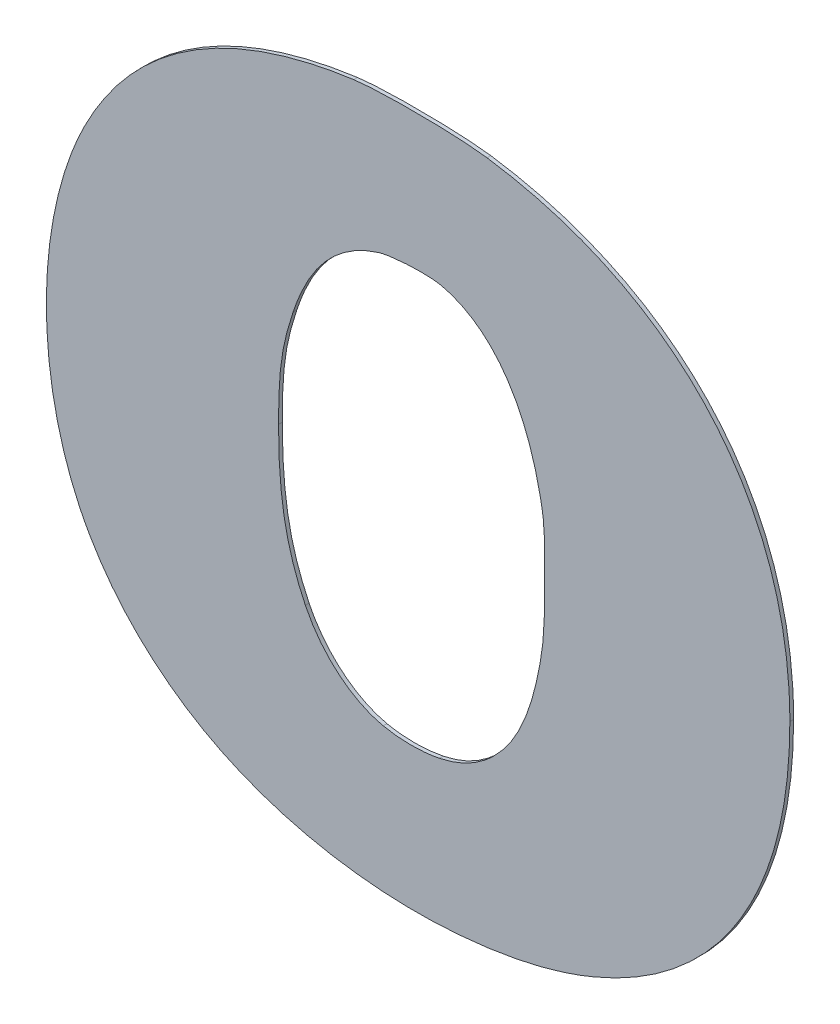
ISO-10303-21;
HEADER;
FILE_DESCRIPTION(('STEP AP214'),'2;1');
FILE_NAME('part.step','',(''),(''),'','','');
FILE_SCHEMA(('AUTOMOTIVE_DESIGN { 1 0 10303 214 1 1 1 1 }'));
ENDSEC;
DATA;
#1=APPLICATION_CONTEXT('core data for automotive mechanical design processes');
#2=APPLICATION_PROTOCOL_DEFINITION('international standard','automotive_design',2000,#1);
#3=PRODUCT_CONTEXT('',#1,'mechanical');
#4=PRODUCT('Part','Part','',(#3));
#5=PRODUCT_RELATED_PRODUCT_CATEGORY('part','',(#4));
#6=PRODUCT_DEFINITION_FORMATION('','',#4);
#7=PRODUCT_DEFINITION_CONTEXT('part definition',#1,'design');
#8=PRODUCT_DEFINITION('design','',#6,#7);
#9=PRODUCT_DEFINITION_SHAPE('','',#8);
#10=(LENGTH_UNIT() NAMED_UNIT(*) SI_UNIT(.MILLI.,.METRE.));
#11=(NAMED_UNIT(*) PLANE_ANGLE_UNIT() SI_UNIT($,.RADIAN.));
#12=(NAMED_UNIT(*) SI_UNIT($,.STERADIAN.) SOLID_ANGLE_UNIT());
#13=UNCERTAINTY_MEASURE_WITH_UNIT(LENGTH_MEASURE(1.E-05),#10,'distance_accuracy_value','');
#14=(GEOMETRIC_REPRESENTATION_CONTEXT(3) GLOBAL_UNCERTAINTY_ASSIGNED_CONTEXT((#13)) GLOBAL_UNIT_ASSIGNED_CONTEXT((#10,
#11,#12)) REPRESENTATION_CONTEXT('',''));
#15=CARTESIAN_POINT('',(0.,0.,0.));
#16=DIRECTION('',(0.,0.,1.));
#17=DIRECTION('',(1.,0.,0.));
#18=AXIS2_PLACEMENT_3D('',#15,#16,#17);
#19=CARTESIAN_POINT('',(-0.260986287756,-0.254246271886,0.002950587767671));
#20=CARTESIAN_POINT('',(-0.260986287756,-0.254246271886,-0.00064941223232888));
#21=CARTESIAN_POINT('',(-0.314815367579,-0.250637417308,0.002950587767671));
#22=CARTESIAN_POINT('',(-0.314815367579,-0.250637417308,-0.00064941223232888));
#23=CARTESIAN_POINT('',(-0.364272880494,-0.236795568774,0.002950587767671));
#24=CARTESIAN_POINT('',(-0.364272880494,-0.236795568774,-0.00064941223232888));
#25=CARTESIAN_POINT('',(-0.404177297623,-0.214170874374,0.002950587767671));
#26=CARTESIAN_POINT('',(-0.404177297623,-0.214170874374,-0.00064941223232888));
#27=B_SPLINE_SURFACE_WITH_KNOTS('',3,1,((#19,#20),(#21,#22),(#23,#24),(#25,#26)),.UNSPECIFIED.,
.F.,.F.,.F.,(4,4),(2,2),(0.,1.),(0.,0.000359999999999988),.UNSPECIFIED.);
#28=DIRECTION('',(0.,0.,1.));
#29=VECTOR('',#28,1.);
#30=CARTESIAN_POINT('',(-0.260986287756,-0.254246271886,-4.94122323289002E-05));
#31=LINE('',#30,#29);
#32=CARTESIAN_POINT('',(-0.260986326892577,-0.254246377310995,-4.94122323289002E-05));
#33=VERTEX_POINT('',#32);
#34=CARTESIAN_POINT('',(-0.260986323137633,-0.254246377562793,0.002950587767671));
#35=VERTEX_POINT('',#34);
#36=EDGE_CURVE('E11',#33,#35,#31,.T.);
#37=CARTESIAN_POINT('',(-0.260986287756,-0.254246271886,0.002950587767671));
#38=CARTESIAN_POINT('',(-0.314815367579,-0.250637417308,0.002950587767671));
#39=CARTESIAN_POINT('',(-0.364272880494,-0.236795568774,0.002950587767671));
#40=CARTESIAN_POINT('',(-0.404177297623,-0.214170874374,0.002950587767671));
#41=B_SPLINE_CURVE_WITH_KNOTS('',3,(#37,#38,#39,#40),.UNSPECIFIED.,.F.,.F.,(4,4),(0.,1.),.UNSPECIFIED.);
#42=CARTESIAN_POINT('',(-0.404177297623,-0.214170874374,0.002950587767671));
#43=VERTEX_POINT('',#42);
#44=EDGE_CURVE('E27',#35,#43,#41,.T.);
#45=DIRECTION('',(0.,0.,1.));
#46=VECTOR('',#45,1.);
#47=CARTESIAN_POINT('',(-0.404177297623,-0.214170874374,-4.94122323289E-05));
#48=LINE('',#47,#46);
#49=CARTESIAN_POINT('',(-0.404177297623,-0.214170874374,-4.94122323289E-05));
#50=VERTEX_POINT('',#49);
#51=EDGE_CURVE('E449',#50,#43,#48,.T.);
#52=CARTESIAN_POINT('',(-0.404177297623,-0.214170874374,-4.94122323289002E-05));
#53=CARTESIAN_POINT('',(-0.364272880494,-0.236795568774,-4.94122323289002E-05));
#54=CARTESIAN_POINT('',(-0.314815367579,-0.250637417308,-4.94122323289002E-05));
#55=CARTESIAN_POINT('',(-0.260986287756,-0.254246271886,-4.94122323289002E-05));
#56=B_SPLINE_CURVE_WITH_KNOTS('',3,(#52,#53,#54,#55),.UNSPECIFIED.,.F.,.F.,(4,4),(0.,1.),.UNSPECIFIED.);
#57=EDGE_CURVE('E469',#33,#50,#56,.F.);
#58=ORIENTED_EDGE('',*,*,#36,.T.);
#59=ORIENTED_EDGE('',*,*,#44,.T.);
#60=ORIENTED_EDGE('',*,*,#51,.F.);
#61=ORIENTED_EDGE('',*,*,#57,.F.);
#62=EDGE_LOOP('',(#58,#59,#60,#61));
#63=FACE_BOUND('',#62,.T.);
#64=ADVANCED_FACE('F17',(#63),#27,.T.);
#65=CARTESIAN_POINT('',(-0.404177297623,-0.214170874374,0.002950587767671));
#66=CARTESIAN_POINT('',(-0.404177297623,-0.214170874374,-0.00064941223232888));
#67=CARTESIAN_POINT('',(-0.448275198308,-0.189168548063,0.002950587767671));
#68=CARTESIAN_POINT('',(-0.448275198308,-0.189168548063,-0.00064941223232888));
#69=CARTESIAN_POINT('',(-0.482670704263,-0.152874736419,0.002950587767671));
#70=CARTESIAN_POINT('',(-0.482670704263,-0.152874736419,-0.00064941223232888));
#71=CARTESIAN_POINT('',(-0.503606742316,-0.10925374049,0.002950587767671));
#72=CARTESIAN_POINT('',(-0.503606742316,-0.10925374049,-0.00064941223232888));
#73=B_SPLINE_SURFACE_WITH_KNOTS('',3,1,((#65,#66),(#67,#68),(#69,#70),(#71,#72)),.UNSPECIFIED.,
.F.,.F.,.F.,(4,4),(2,2),(0.,1.),(0.,0.000359999999999988),.UNSPECIFIED.);
#74=CARTESIAN_POINT('',(-0.404177297623,-0.214170874374,0.002950587767671));
#75=CARTESIAN_POINT('',(-0.448275198308,-0.189168548063,0.002950587767671));
#76=CARTESIAN_POINT('',(-0.482670704263,-0.152874736419,0.002950587767671));
#77=CARTESIAN_POINT('',(-0.503606742316,-0.10925374049,0.002950587767671));
#78=B_SPLINE_CURVE_WITH_KNOTS('',3,(#74,#75,#76,#77),.UNSPECIFIED.,.F.,.F.,(4,4),(0.,1.),.UNSPECIFIED.);
#79=CARTESIAN_POINT('',(-0.503606742316,-0.10925374049,0.002950587767671));
#80=VERTEX_POINT('',#79);
#81=EDGE_CURVE('E445',#43,#80,#78,.T.);
#82=DIRECTION('',(0.,0.,1.));
#83=VECTOR('',#82,1.);
#84=CARTESIAN_POINT('',(-0.503606742316,-0.10925374049,-4.94122323289E-05));
#85=LINE('',#84,#83);
#86=CARTESIAN_POINT('',(-0.503606742316,-0.10925374049,-4.94122323289E-05));
#87=VERTEX_POINT('',#86);
#88=EDGE_CURVE('E480',#87,#80,#85,.T.);
#89=CARTESIAN_POINT('',(-0.503606742316,-0.10925374049,-4.94122323289002E-05));
#90=CARTESIAN_POINT('',(-0.482670704263,-0.152874736419,-4.94122323289002E-05));
#91=CARTESIAN_POINT('',(-0.448275198308,-0.189168548063,-4.94122323289002E-05));
#92=CARTESIAN_POINT('',(-0.404177297623,-0.214170874374,-4.94122323289002E-05));
#93=B_SPLINE_CURVE_WITH_KNOTS('',3,(#89,#90,#91,#92),.UNSPECIFIED.,.F.,.F.,(4,4),(0.,1.),.UNSPECIFIED.);
#94=EDGE_CURVE('E473',#50,#87,#93,.F.);
#95=ORIENTED_EDGE('',*,*,#51,.T.);
#96=ORIENTED_EDGE('',*,*,#81,.T.);
#97=ORIENTED_EDGE('',*,*,#88,.F.);
#98=ORIENTED_EDGE('',*,*,#94,.F.);
#99=EDGE_LOOP('',(#95,#96,#97,#98));
#100=FACE_BOUND('',#99,.T.);
#101=ADVANCED_FACE('F478',(#100),#73,.T.);
#102=CARTESIAN_POINT('',(-0.503606742316,-0.10925374049,0.002950587767671));
#103=CARTESIAN_POINT('',(-0.503606742316,-0.10925374049,-0.00064941223232888));
#104=CARTESIAN_POINT('',(-0.540622635321,-0.03212981605444,0.002950587767671));
#105=CARTESIAN_POINT('',(-0.540622635321,-0.03212981605444,-0.00064941223232888));
#106=CARTESIAN_POINT('',(-0.539096242076,0.07896214475445,0.002950587767671));
#107=CARTESIAN_POINT('',(-0.539096242076,0.07896214475445,-0.00064941223232888));
#108=CARTESIAN_POINT('',(-0.499949731596,0.156907418266,0.002950587767671));
#109=CARTESIAN_POINT('',(-0.499949731596,0.156907418266,-0.00064941223232888));
#110=B_SPLINE_SURFACE_WITH_KNOTS('',3,1,((#102,#103),(#104,#105),(#106,#107),(#108,#109)),
.UNSPECIFIED.,.F.,.F.,.F.,(4,4),(2,2),(0.,1.),(0.,0.000359999999999988),.UNSPECIFIED.);
#111=CARTESIAN_POINT('',(-0.503606742316,-0.10925374049,0.002950587767671));
#112=CARTESIAN_POINT('',(-0.540622635321,-0.03212981605444,0.002950587767671));
#113=CARTESIAN_POINT('',(-0.539096242076,0.07896214475445,0.002950587767671));
#114=CARTESIAN_POINT('',(-0.499949731596,0.156907418266,0.002950587767671));
#115=B_SPLINE_CURVE_WITH_KNOTS('',3,(#111,#112,#113,#114),.UNSPECIFIED.,.F.,.F.,(4,4),(0.,1.),.UNSPECIFIED.);
#116=CARTESIAN_POINT('',(-0.499949731596,0.156907418266,0.002950587767671));
#117=VERTEX_POINT('',#116);
#118=EDGE_CURVE('E481',#80,#117,#115,.T.);
#119=DIRECTION('',(0.,0.,1.));
#120=VECTOR('',#119,1.);
#121=CARTESIAN_POINT('',(-0.499949731596,0.156907418266,-4.94122323289E-05));
#122=LINE('',#121,#120);
#123=CARTESIAN_POINT('',(-0.499949731596,0.156907418266,-4.94122323289E-05));
#124=VERTEX_POINT('',#123);
#125=EDGE_CURVE('E1027',#124,#117,#122,.T.);
#126=CARTESIAN_POINT('',(-0.503606742316,-0.10925374049,-4.94122323289E-05));
#127=CARTESIAN_POINT('',(-0.540622635321,-0.03212981605444,-4.94122323289E-05));
#128=CARTESIAN_POINT('',(-0.539096242076,0.07896214475445,-4.94122323289E-05));
#129=CARTESIAN_POINT('',(-0.499949731596,0.156907418266,-4.94122323289E-05));
#130=B_SPLINE_CURVE_WITH_KNOTS('',3,(#126,#127,#128,#129),.UNSPECIFIED.,.F.,.F.,(4,4),(0.,1.),.UNSPECIFIED.);
#131=EDGE_CURVE('E1028',#87,#124,#130,.T.);
#132=ORIENTED_EDGE('',*,*,#88,.T.);
#133=ORIENTED_EDGE('',*,*,#118,.T.);
#134=ORIENTED_EDGE('',*,*,#125,.F.);
#135=ORIENTED_EDGE('',*,*,#131,.F.);
#136=EDGE_LOOP('',(#132,#133,#134,#135));
#137=FACE_BOUND('',#136,.T.);
#138=ADVANCED_FACE('F288',(#137),#110,.T.);
#139=CARTESIAN_POINT('',(-0.499949731596,0.156907418266,0.002950587767671));
#140=CARTESIAN_POINT('',(-0.499949731596,0.156907418266,-0.00064941223232888));
#141=CARTESIAN_POINT('',(-0.460287858503,0.235878921768,0.002950587767671));
#142=CARTESIAN_POINT('',(-0.460287858503,0.235878921768,-0.00064941223232888));
#143=CARTESIAN_POINT('',(-0.387406244325,0.283300900132,0.002950587767671));
#144=CARTESIAN_POINT('',(-0.387406244325,0.283300900132,-0.00064941223232888));
#145=CARTESIAN_POINT('',(-0.284138936396,0.297329387866,0.002950587767671));
#146=CARTESIAN_POINT('',(-0.284138936396,0.297329387866,-0.00064941223232888));
#147=B_SPLINE_SURFACE_WITH_KNOTS('',3,1,((#139,#140),(#141,#142),(#143,#144),(#145,#146)),
.UNSPECIFIED.,.F.,.F.,.F.,(4,4),(2,2),(0.,1.),(0.,0.000359999999999988),.UNSPECIFIED.);
#148=CARTESIAN_POINT('',(-0.499949731596,0.156907418266,0.002950587767671));
#149=CARTESIAN_POINT('',(-0.460287858503,0.235878921768,0.002950587767671));
#150=CARTESIAN_POINT('',(-0.387406244325,0.283300900132,0.002950587767671));
#151=CARTESIAN_POINT('',(-0.284138936396,0.297329387866,0.002950587767671));
#152=B_SPLINE_CURVE_WITH_KNOTS('',3,(#148,#149,#150,#151),.UNSPECIFIED.,.F.,.F.,(4,4),(0.,1.),.UNSPECIFIED.);
#153=CARTESIAN_POINT('',(-0.284138936396,0.297329387866,0.002950587767671));
#154=VERTEX_POINT('',#153);
#155=EDGE_CURVE('E256',#117,#154,#152,.T.);
#156=DIRECTION('',(0.,0.,1.));
#157=VECTOR('',#156,1.);
#158=CARTESIAN_POINT('',(-0.284138936396,0.297329387866,-4.94122323289E-05));
#159=LINE('',#158,#157);
#160=CARTESIAN_POINT('',(-0.284138936396,0.297329387866,-4.94122323289E-05));
#161=VERTEX_POINT('',#160);
#162=EDGE_CURVE('E253',#161,#154,#159,.T.);
#163=CARTESIAN_POINT('',(-0.284138936396,0.297329387866,-4.94122323289002E-05));
#164=CARTESIAN_POINT('',(-0.387406244325,0.283300900132,-4.94122323289002E-05));
#165=CARTESIAN_POINT('',(-0.460287858503,0.235878921768,-4.94122323289002E-05));
#166=CARTESIAN_POINT('',(-0.499949731596,0.156907418266,-4.94122323289002E-05));
#167=B_SPLINE_CURVE_WITH_KNOTS('',3,(#163,#164,#165,#166),.UNSPECIFIED.,.F.,.F.,(4,4),(0.,1.),.UNSPECIFIED.);
#168=EDGE_CURVE('E249',#124,#161,#167,.F.);
#169=ORIENTED_EDGE('',*,*,#125,.T.);
#170=ORIENTED_EDGE('',*,*,#155,.T.);
#171=ORIENTED_EDGE('',*,*,#162,.F.);
#172=ORIENTED_EDGE('',*,*,#168,.F.);
#173=EDGE_LOOP('',(#169,#170,#171,#172));
#174=FACE_BOUND('',#173,.T.);
#175=ADVANCED_FACE('F275',(#174),#147,.T.);
#176=CARTESIAN_POINT('',(-0.284138936396,0.297329387866,0.002950587767671));
#177=CARTESIAN_POINT('',(-0.284138936396,0.297329387866,-0.00064941223232888));
#178=CARTESIAN_POINT('',(-0.260930606441,0.300482162301,0.002950587767671));
#179=CARTESIAN_POINT('',(-0.260930606441,0.300482162301,-0.00064941223232888));
#180=CARTESIAN_POINT('',(-0.201802736663,0.300025883474,0.002950587767671));
#181=CARTESIAN_POINT('',(-0.201802736663,0.300025883474,-0.00064941223232888));
#182=CARTESIAN_POINT('',(-0.177346047508,0.296505306879,0.002950587767671));
#183=CARTESIAN_POINT('',(-0.177346047508,0.296505306879,-0.00064941223232888));
#184=B_SPLINE_SURFACE_WITH_KNOTS('',3,1,((#176,#177),(#178,#179),(#180,#181),(#182,#183)),
.UNSPECIFIED.,.F.,.F.,.F.,(4,4),(2,2),(0.,1.),(0.,0.000359999999999988),.UNSPECIFIED.);
#185=CARTESIAN_POINT('',(-0.284138936396,0.297329387866,0.002950587767671));
#186=CARTESIAN_POINT('',(-0.260930606441,0.300482162301,0.002950587767671));
#187=CARTESIAN_POINT('',(-0.201802736663,0.300025883474,0.002950587767671));
#188=CARTESIAN_POINT('',(-0.177346047508,0.296505306879,0.002950587767671));
#189=B_SPLINE_CURVE_WITH_KNOTS('',3,(#185,#186,#187,#188),.UNSPECIFIED.,.F.,.F.,(4,4),(0.,1.),.UNSPECIFIED.);
#190=CARTESIAN_POINT('',(-0.177346047508,0.296505306879,0.002950587767671));
#191=VERTEX_POINT('',#190);
#192=EDGE_CURVE('E304',#154,#191,#189,.T.);
#193=DIRECTION('',(0.,0.,1.));
#194=VECTOR('',#193,1.);
#195=CARTESIAN_POINT('',(-0.177346047508,0.296505306879,-4.94122323289E-05));
#196=LINE('',#195,#194);
#197=CARTESIAN_POINT('',(-0.177346047508,0.296505306879,-4.94122323289E-05));
#198=VERTEX_POINT('',#197);
#199=EDGE_CURVE('E311',#198,#191,#196,.T.);
#200=CARTESIAN_POINT('',(-0.284138936396,0.297329387866,-4.94122323289E-05));
#201=CARTESIAN_POINT('',(-0.260930606441,0.300482162301,-4.94122323289E-05));
#202=CARTESIAN_POINT('',(-0.201802736663,0.300025883474,-4.94122323289E-05));
#203=CARTESIAN_POINT('',(-0.177346047508,0.296505306879,-4.94122323289E-05));
#204=B_SPLINE_CURVE_WITH_KNOTS('',3,(#200,#201,#202,#203),.UNSPECIFIED.,.F.,.F.,(4,4),(0.,1.),.UNSPECIFIED.);
#205=EDGE_CURVE('E321',#161,#198,#204,.T.);
#206=ORIENTED_EDGE('',*,*,#162,.T.);
#207=ORIENTED_EDGE('',*,*,#192,.T.);
#208=ORIENTED_EDGE('',*,*,#199,.F.);
#209=ORIENTED_EDGE('',*,*,#205,.F.);
#210=EDGE_LOOP('',(#206,#207,#208,#209));
#211=FACE_BOUND('',#210,.T.);
#212=ADVANCED_FACE('F287',(#211),#184,.T.);
#213=CARTESIAN_POINT('',(-0.177346047508,0.296505306879,0.002950587767671));
#214=CARTESIAN_POINT('',(-0.177346047508,0.296505306879,-0.00064941223232888));
#215=CARTESIAN_POINT('',(-0.02531742937421,0.27462062511,0.002950587767671));
#216=CARTESIAN_POINT('',(-0.02531742937421,0.27462062511,-0.00064941223232888));
#217=CARTESIAN_POINT('',(0.06521462787024,0.173905269857,0.002950587767671));
#218=CARTESIAN_POINT('',(0.06521462787024,0.173905269857,-0.00064941223232888));
#219=CARTESIAN_POINT('',(0.06521462787024,0.02666078687889,0.002950587767671));
#220=CARTESIAN_POINT('',(0.06521462787024,0.02666078687889,-0.00064941223232888));
#221=B_SPLINE_SURFACE_WITH_KNOTS('',3,1,((#213,#214),(#215,#216),(#217,#218),(#219,#220)),
.UNSPECIFIED.,.F.,.F.,.F.,(4,4),(2,2),(0.,1.),(0.,0.000359999999999988),.UNSPECIFIED.);
#222=CARTESIAN_POINT('',(-0.177346047508,0.296505306879,0.002950587767671));
#223=CARTESIAN_POINT('',(-0.02531742937421,0.27462062511,0.002950587767671));
#224=CARTESIAN_POINT('',(0.06521462787024,0.173905269857,0.002950587767671));
#225=CARTESIAN_POINT('',(0.06521462787024,0.0266607868788901,0.002950587767671));
#226=B_SPLINE_CURVE_WITH_KNOTS('',3,(#222,#223,#224,#225),.UNSPECIFIED.,.F.,.F.,(4,4),(0.,
0.040304320984337),.UNSPECIFIED.);
#227=CARTESIAN_POINT('',(0.06521462787024,0.02666078687889,0.002950587767671));
#228=VERTEX_POINT('',#227);
#229=EDGE_CURVE('E323',#191,#228,#226,.T.);
#230=DIRECTION('',(0.,0.,1.));
#231=VECTOR('',#230,1.);
#232=CARTESIAN_POINT('',(0.06521462787024,0.02666078687889,-4.94122323289E-05));
#233=LINE('',#232,#231);
#234=CARTESIAN_POINT('',(0.06521462787024,0.02666078687889,-4.94122323289E-05));
#235=VERTEX_POINT('',#234);
#236=EDGE_CURVE('E332',#235,#228,#233,.T.);
#237=CARTESIAN_POINT('',(-0.177346047508,0.296505306879,-4.94122323289002E-05));
#238=CARTESIAN_POINT('',(-0.02531742937421,0.27462062511,-4.94122323289002E-05));
#239=CARTESIAN_POINT('',(0.06521462787024,0.173905269857,-4.94122323289002E-05));
#240=CARTESIAN_POINT('',(0.06521462787024,0.0266607868788901,-4.94122323289002E-05));
#241=B_SPLINE_CURVE_WITH_KNOTS('',3,(#237,#238,#239,#240),.UNSPECIFIED.,.F.,.F.,(4,4),(0.,
0.040304320984337),.UNSPECIFIED.);
#242=EDGE_CURVE('E342',#198,#235,#241,.T.);
#243=ORIENTED_EDGE('',*,*,#199,.T.);
#244=ORIENTED_EDGE('',*,*,#229,.T.);
#245=ORIENTED_EDGE('',*,*,#236,.F.);
#246=ORIENTED_EDGE('',*,*,#242,.F.);
#247=EDGE_LOOP('',(#243,#244,#245,#246));
#248=FACE_BOUND('',#247,.T.);
#249=ADVANCED_FACE('F376',(#248),#221,.T.);
#250=CARTESIAN_POINT('',(0.06521462787024,0.02666078687889,0.002950587767671));
#251=CARTESIAN_POINT('',(0.06521462787024,0.02666078687889,-0.00064941223232888));
#252=CARTESIAN_POINT('',(0.06521462787024,-0.105759290899,0.002950587767671));
#253=CARTESIAN_POINT('',(0.06521462787024,-0.105759290899,-0.00064941223232888));
#254=CARTESIAN_POINT('',(0.000904943603572406,-0.199930874632,0.002950587767671));
#255=CARTESIAN_POINT('',(0.000904943603572406,-0.199930874632,-0.00064941223232888));
#256=CARTESIAN_POINT('',(-0.115303352752,-0.237679677299,0.002950587767671));
#257=CARTESIAN_POINT('',(-0.115303352752,-0.237679677299,-0.00064941223232888));
#258=B_SPLINE_SURFACE_WITH_KNOTS('',3,1,((#250,#251),(#252,#253),(#254,#255),(#256,#257)),
.UNSPECIFIED.,.F.,.F.,.F.,(4,4),(2,2),(0.,1.),(0.,0.000359999999999988),.UNSPECIFIED.);
#259=CARTESIAN_POINT('',(0.06521462787024,0.02666078687889,0.002950587767671));
#260=CARTESIAN_POINT('',(0.06521462787024,-0.105759290899,0.002950587767671));
#261=CARTESIAN_POINT('',(0.000904943603572406,-0.199930874632,0.002950587767671));
#262=CARTESIAN_POINT('',(-0.115303352752,-0.237679677299,0.002950587767671));
#263=B_SPLINE_CURVE_WITH_KNOTS('',3,(#259,#260,#261,#262),.UNSPECIFIED.,.F.,.F.,(4,4),(0.,1.),.UNSPECIFIED.);
#264=CARTESIAN_POINT('',(-0.115303352752,-0.237679677299,0.002950587767671));
#265=VERTEX_POINT('',#264);
#266=EDGE_CURVE('E347',#228,#265,#263,.T.);
#267=DIRECTION('',(0.,0.,1.));
#268=VECTOR('',#267,1.);
#269=CARTESIAN_POINT('',(-0.115303352752,-0.237679677299,-4.94122323289E-05));
#270=LINE('',#269,#268);
#271=CARTESIAN_POINT('',(-0.115303352752,-0.237679677299,-4.94122323289E-05));
#272=VERTEX_POINT('',#271);
#273=EDGE_CURVE('E402',#272,#265,#270,.T.);
#274=CARTESIAN_POINT('',(-0.115303352752,-0.237679677299,-4.94122323289002E-05));
#275=CARTESIAN_POINT('',(0.000904943603572406,-0.199930874632,-4.94122323289002E-05));
#276=CARTESIAN_POINT('',(0.06521462787024,-0.105759290899,-4.94122323289002E-05));
#277=CARTESIAN_POINT('',(0.06521462787024,0.02666078687889,-4.94122323289002E-05));
#278=B_SPLINE_CURVE_WITH_KNOTS('',3,(#274,#275,#276,#277),.UNSPECIFIED.,.F.,.F.,(4,4),(0.,1.),.UNSPECIFIED.);
#279=EDGE_CURVE('E401',#235,#272,#278,.F.);
#280=ORIENTED_EDGE('',*,*,#236,.T.);
#281=ORIENTED_EDGE('',*,*,#266,.T.);
#282=ORIENTED_EDGE('',*,*,#273,.F.);
#283=ORIENTED_EDGE('',*,*,#279,.F.);
#284=EDGE_LOOP('',(#280,#281,#282,#283));
#285=FACE_BOUND('',#284,.T.);
#286=ADVANCED_FACE('F364',(#285),#258,.T.);
#287=CARTESIAN_POINT('',(-0.115303352752,-0.237679677299,0.002950587767671));
#288=CARTESIAN_POINT('',(-0.115303352752,-0.237679677299,-0.00064941223232888));
#289=CARTESIAN_POINT('',(-0.157555214174,-0.251404674543,0.002950587767671));
#290=CARTESIAN_POINT('',(-0.157555214174,-0.251404674543,-0.00064941223232888));
#291=CARTESIAN_POINT('',(-0.211637989196,-0.257554827343,0.002950587767671));
#292=CARTESIAN_POINT('',(-0.211637989196,-0.257554827343,-0.00064941223232888));
#293=CARTESIAN_POINT('',(-0.260986362263,-0.254246482988,0.002950587767671));
#294=CARTESIAN_POINT('',(-0.260986362263,-0.254246482988,-0.00064941223232888));
#295=B_SPLINE_SURFACE_WITH_KNOTS('',3,1,((#287,#288),(#289,#290),(#291,#292),(#293,#294)),
.UNSPECIFIED.,.F.,.F.,.F.,(4,4),(2,2),(0.,1.),(0.,0.000359999999999988),.UNSPECIFIED.);
#296=CARTESIAN_POINT('',(-0.115303352752,-0.237679677299,0.002950587767671));
#297=CARTESIAN_POINT('',(-0.157555214174,-0.251404674543,0.002950587767671));
#298=CARTESIAN_POINT('',(-0.211637989196,-0.257554827343,0.002950587767671));
#299=CARTESIAN_POINT('',(-0.260986362263,-0.254246482988,0.002950587767671));
#300=B_SPLINE_CURVE_WITH_KNOTS('',3,(#296,#297,#298,#299),.UNSPECIFIED.,.F.,.F.,(4,4),(0.,1.),.UNSPECIFIED.);
#301=EDGE_CURVE('E404',#265,#35,#300,.T.);
#302=CARTESIAN_POINT('',(-0.260986362263,-0.254246482988,-4.94122323289002E-05));
#303=CARTESIAN_POINT('',(-0.211637989196,-0.257554827343,-4.94122323289002E-05));
#304=CARTESIAN_POINT('',(-0.157555214174,-0.251404674543,-4.94122323289002E-05));
#305=CARTESIAN_POINT('',(-0.115303352752,-0.237679677299,-4.94122323289002E-05));
#306=B_SPLINE_CURVE_WITH_KNOTS('',3,(#302,#303,#304,#305),.UNSPECIFIED.,.F.,.F.,(4,4),(0.,1.),.UNSPECIFIED.);
#307=EDGE_CURVE('E406',#272,#33,#306,.F.);
#308=ORIENTED_EDGE('',*,*,#273,.T.);
#309=ORIENTED_EDGE('',*,*,#301,.T.);
#310=ORIENTED_EDGE('',*,*,#36,.F.);
#311=ORIENTED_EDGE('',*,*,#307,.F.);
#312=EDGE_LOOP('',(#308,#309,#310,#311));
#313=FACE_BOUND('',#312,.T.);
#314=ADVANCED_FACE('F375',(#313),#295,.T.);
#315=CARTESIAN_POINT('',(-0.215427075401,-0.139132031423,0.002950587767671));
#316=CARTESIAN_POINT('',(-0.215427075401,-0.139132031423,-0.00064941223232888));
#317=CARTESIAN_POINT('',(-0.198030513801,-0.135463347992,0.002950587767671));
#318=CARTESIAN_POINT('',(-0.198030513801,-0.135463347992,-0.00064941223232888));
#319=CARTESIAN_POINT('',(-0.184004633801,-0.127858949237,0.002950587767671));
#320=CARTESIAN_POINT('',(-0.184004633801,-0.127858949237,-0.00064941223232888));
#321=CARTESIAN_POINT('',(-0.171421823756,-0.115273680472,0.002950587767671));
#322=CARTESIAN_POINT('',(-0.171421823756,-0.115273680472,-0.00064941223232888));
#323=B_SPLINE_SURFACE_WITH_KNOTS('',3,1,((#315,#316),(#317,#318),(#319,#320),(#321,#322)),
.UNSPECIFIED.,.F.,.F.,.F.,(4,4),(2,2),(0.,1.),(0.,0.000359999999999988),.UNSPECIFIED.);
#324=DIRECTION('',(0.,0.,1.));
#325=VECTOR('',#324,1.);
#326=CARTESIAN_POINT('',(-0.215427075401,-0.139132031423,-4.94122323289002E-05));
#327=LINE('',#326,#325);
#328=CARTESIAN_POINT('',(-0.215427071496612,-0.139131875378257,-4.94122323289002E-05));
#329=VERTEX_POINT('',#328);
#330=CARTESIAN_POINT('',(-0.215427079333868,-0.139131877031377,0.002950587767671));
#331=VERTEX_POINT('',#330);
#332=EDGE_CURVE('E177',#329,#331,#327,.T.);
#333=CARTESIAN_POINT('',(-0.215427047992814,-0.139132025643006,0.002950587767671));
#334=CARTESIAN_POINT('',(-0.198030499069201,-0.135463340004872,0.002950587767671));
#335=CARTESIAN_POINT('',(-0.18400462719295,-0.127858942627659,0.002950587767671));
#336=CARTESIAN_POINT('',(-0.171421823756,-0.115273680472,0.002950587767671));
#337=B_SPLINE_CURVE_WITH_KNOTS('',3,(#333,#334,#335,#336),.UNSPECIFIED.,.F.,.F.,(4,4),
(5.25164872490667E-07,1.),.UNSPECIFIED.);
#338=CARTESIAN_POINT('',(-0.171421823756,-0.115273680472,0.002950587767671));
#339=VERTEX_POINT('',#338);
#340=EDGE_CURVE('E409',#331,#339,#337,.T.);
#341=DIRECTION('',(0.,0.,1.));
#342=VECTOR('',#341,1.);
#343=CARTESIAN_POINT('',(-0.171421823756,-0.115273680472,-4.94122323289E-05));
#344=LINE('',#343,#342);
#345=CARTESIAN_POINT('',(-0.171421823756,-0.115273680472,-4.94122323289E-05));
#346=VERTEX_POINT('',#345);
#347=EDGE_CURVE('E413',#346,#339,#344,.T.);
#348=CARTESIAN_POINT('',(-0.215427040155477,-0.139132023990222,-4.94122323289E-05));
#349=CARTESIAN_POINT('',(-0.198030494856662,-0.135463337720963,-4.94122323289E-05));
#350=CARTESIAN_POINT('',(-0.184004625303386,-0.127858940737726,-4.94122323289E-05));
#351=CARTESIAN_POINT('',(-0.171421823756,-0.115273680472,-4.94122323289E-05));
#352=B_SPLINE_CURVE_WITH_KNOTS('',3,(#348,#349,#350,#351),.UNSPECIFIED.,.F.,.F.,(4,4),
(6.75335122205991E-07,1.),.UNSPECIFIED.);
#353=EDGE_CURVE('E752',#329,#346,#352,.T.);
#354=ORIENTED_EDGE('',*,*,#332,.T.);
#355=ORIENTED_EDGE('',*,*,#340,.T.);
#356=ORIENTED_EDGE('',*,*,#347,.F.);
#357=ORIENTED_EDGE('',*,*,#353,.F.);
#358=EDGE_LOOP('',(#354,#355,#356,#357));
#359=FACE_BOUND('',#358,.T.);
#360=ADVANCED_FACE('F584',(#359),#323,.T.);
#361=CARTESIAN_POINT('',(-0.171421823756,-0.115273680472,0.002950587767671));
#362=CARTESIAN_POINT('',(-0.171421823756,-0.115273680472,-0.00064941223232888));
#363=CARTESIAN_POINT('',(-0.153024016734,-0.09687213569888,0.002950587767671));
#364=CARTESIAN_POINT('',(-0.153024016734,-0.09687213569888,-0.00064941223232888));
#365=CARTESIAN_POINT('',(-0.141936058779,-0.07188648646333,0.002950587767671));
#366=CARTESIAN_POINT('',(-0.141936058779,-0.07188648646333,-0.00064941223232888));
#367=CARTESIAN_POINT('',(-0.134887231401,-0.03294624769,0.002950587767671));
#368=CARTESIAN_POINT('',(-0.134887231401,-0.03294624769,-0.00064941223232888));
#369=B_SPLINE_SURFACE_WITH_KNOTS('',3,1,((#361,#362),(#363,#364),(#365,#366),(#367,#368)),
.UNSPECIFIED.,.F.,.F.,.F.,(4,4),(2,2),(0.,1.),(0.,0.000359999999999988),.UNSPECIFIED.);
#370=CARTESIAN_POINT('',(-0.171421823756,-0.115273680472,0.002950587767671));
#371=CARTESIAN_POINT('',(-0.153024016734,-0.09687213569888,0.002950587767671));
#372=CARTESIAN_POINT('',(-0.141936058779,-0.07188648646333,0.002950587767671));
#373=CARTESIAN_POINT('',(-0.134887231401,-0.03294624769,0.002950587767671));
#374=B_SPLINE_CURVE_WITH_KNOTS('',3,(#370,#371,#372,#373),.UNSPECIFIED.,.F.,.F.,(4,4),(0.,1.),.UNSPECIFIED.);
#375=CARTESIAN_POINT('',(-0.134887231401,-0.03294624769,0.002950587767671));
#376=VERTEX_POINT('',#375);
#377=EDGE_CURVE('E746',#339,#376,#374,.T.);
#378=DIRECTION('',(0.,0.,1.));
#379=VECTOR('',#378,1.);
#380=CARTESIAN_POINT('',(-0.134887231401,-0.03294624769,-4.94122323289E-05));
#381=LINE('',#380,#379);
#382=CARTESIAN_POINT('',(-0.134887231401,-0.03294624769,-4.94122323289E-05));
#383=VERTEX_POINT('',#382);
#384=EDGE_CURVE('E773',#383,#376,#381,.T.);
#385=CARTESIAN_POINT('',(-0.171421823756,-0.115273680472,-4.94122323289E-05));
#386=CARTESIAN_POINT('',(-0.153024016734,-0.09687213569888,-4.94122323289E-05));
#387=CARTESIAN_POINT('',(-0.141936058779,-0.07188648646333,-4.94122323289E-05));
#388=CARTESIAN_POINT('',(-0.134887231401,-0.03294624769,-4.94122323289E-05));
#389=B_SPLINE_CURVE_WITH_KNOTS('',3,(#385,#386,#387,#388),.UNSPECIFIED.,.F.,.F.,(4,4),(0.,1.),.UNSPECIFIED.);
#390=EDGE_CURVE('E751',#346,#383,#389,.T.);
#391=ORIENTED_EDGE('',*,*,#347,.T.);
#392=ORIENTED_EDGE('',*,*,#377,.T.);
#393=ORIENTED_EDGE('',*,*,#384,.F.);
#394=ORIENTED_EDGE('',*,*,#390,.F.);
#395=EDGE_LOOP('',(#391,#392,#393,#394));
#396=FACE_BOUND('',#395,.T.);
#397=ADVANCED_FACE('F592',(#396),#369,.T.);
#398=CARTESIAN_POINT('',(-0.134887231401,-0.03294624769,0.002950587767671));
#399=CARTESIAN_POINT('',(-0.134887231401,-0.03294624769,-0.00064941223232888));
#400=CARTESIAN_POINT('',(-0.131958871045,-0.01676917395666,0.002950587767671));
#401=CARTESIAN_POINT('',(-0.131958871045,-0.01676917395666,-0.00064941223232888));
#402=CARTESIAN_POINT('',(-0.131304454156,-0.006473147361106,0.002950587767671));
#403=CARTESIAN_POINT('',(-0.131304454156,-0.006473147361106,-0.00064941223232888));
#404=CARTESIAN_POINT('',(-0.131165995934,0.02559239853223,0.002950587767671));
#405=CARTESIAN_POINT('',(-0.131165995934,0.02559239853223,-0.00064941223232888));
#406=B_SPLINE_SURFACE_WITH_KNOTS('',3,1,((#398,#399),(#400,#401),(#402,#403),(#404,#405)),
.UNSPECIFIED.,.F.,.F.,.F.,(4,4),(2,2),(0.,1.),(0.,0.000359999999999988),.UNSPECIFIED.);
#407=CARTESIAN_POINT('',(-0.134887231401,-0.03294624769,0.002950587767671));
#408=CARTESIAN_POINT('',(-0.131958871045,-0.01676917395666,0.002950587767671));
#409=CARTESIAN_POINT('',(-0.131304454156,-0.006473147361106,0.002950587767671));
#410=CARTESIAN_POINT('',(-0.131165995934,0.02559239853223,0.002950587767671));
#411=B_SPLINE_CURVE_WITH_KNOTS('',3,(#407,#408,#409,#410),.UNSPECIFIED.,.F.,.F.,(4,4),(0.,1.),.UNSPECIFIED.);
#412=CARTESIAN_POINT('',(-0.131165995934,0.02559239853223,0.002950587767671));
#413=VERTEX_POINT('',#412);
#414=EDGE_CURVE('E781',#376,#413,#411,.T.);
#415=DIRECTION('',(0.,0.,1.));
#416=VECTOR('',#415,1.);
#417=CARTESIAN_POINT('',(-0.131165995934,0.02559239853223,-4.94122323289E-05));
#418=LINE('',#417,#416);
#419=CARTESIAN_POINT('',(-0.131165995934,0.02559239853223,-4.94122323289E-05));
#420=VERTEX_POINT('',#419);
#421=EDGE_CURVE('E788',#420,#413,#418,.T.);
#422=CARTESIAN_POINT('',(-0.134887231401,-0.03294624769,-4.94122323289E-05));
#423=CARTESIAN_POINT('',(-0.131958871045,-0.01676917395666,-4.94122323289E-05));
#424=CARTESIAN_POINT('',(-0.131304454156,-0.006473147361106,-4.94122323289E-05));
#425=CARTESIAN_POINT('',(-0.131165995934,0.02559239853223,-4.94122323289E-05));
#426=B_SPLINE_CURVE_WITH_KNOTS('',3,(#422,#423,#424,#425),.UNSPECIFIED.,.F.,.F.,(4,4),(0.,1.),.UNSPECIFIED.);
#427=EDGE_CURVE('E794',#383,#420,#426,.T.);
#428=ORIENTED_EDGE('',*,*,#384,.T.);
#429=ORIENTED_EDGE('',*,*,#414,.T.);
#430=ORIENTED_EDGE('',*,*,#421,.F.);
#431=ORIENTED_EDGE('',*,*,#427,.F.);
#432=EDGE_LOOP('',(#428,#429,#430,#431));
#433=FACE_BOUND('',#432,.T.);
#434=ADVANCED_FACE('F600',(#433),#406,.T.);
#435=CARTESIAN_POINT('',(-0.131165995934,0.02559239853223,0.002950587767671));
#436=CARTESIAN_POINT('',(-0.131165995934,0.02559239853223,-0.00064941223232888));
#437=CARTESIAN_POINT('',(-0.131017479312,0.05998881098556,0.002950587767671));
#438=CARTESIAN_POINT('',(-0.131017479312,0.05998881098556,-0.00064941223232888));
#439=CARTESIAN_POINT('',(-0.131437076023,0.06667159952778,0.002950587767671));
#440=CARTESIAN_POINT('',(-0.131437076023,0.06667159952778,-0.00064941223232888));
#441=CARTESIAN_POINT('',(-0.134783667134,0.08321315987445,0.002950587767671));
#442=CARTESIAN_POINT('',(-0.134783667134,0.08321315987445,-0.00064941223232888));
#443=B_SPLINE_SURFACE_WITH_KNOTS('',3,1,((#435,#436),(#437,#438),(#439,#440),(#441,#442)),
.UNSPECIFIED.,.F.,.F.,.F.,(4,4),(2,2),(0.,1.),(0.,0.000359999999999988),.UNSPECIFIED.);
#444=CARTESIAN_POINT('',(-0.131165995934,0.02559239853223,0.002950587767671));
#445=CARTESIAN_POINT('',(-0.131017479312,0.05998881098556,0.002950587767671));
#446=CARTESIAN_POINT('',(-0.131437076023,0.06667159952778,0.002950587767671));
#447=CARTESIAN_POINT('',(-0.134783667134,0.08321315987445,0.002950587767671));
#448=B_SPLINE_CURVE_WITH_KNOTS('',3,(#444,#445,#446,#447),.UNSPECIFIED.,.F.,.F.,(4,4),(0.,1.),.UNSPECIFIED.);
#449=CARTESIAN_POINT('',(-0.134783667134,0.08321315987445,0.002950587767671));
#450=VERTEX_POINT('',#449);
#451=EDGE_CURVE('E799',#413,#450,#448,.T.);
#452=DIRECTION('',(0.,0.,1.));
#453=VECTOR('',#452,1.);
#454=CARTESIAN_POINT('',(-0.134783667134,0.08321315987445,-4.94122323289E-05));
#455=LINE('',#454,#453);
#456=CARTESIAN_POINT('',(-0.134783667134,0.08321315987445,-4.94122323289E-05));
#457=VERTEX_POINT('',#456);
#458=EDGE_CURVE('E804',#457,#450,#455,.T.);
#459=CARTESIAN_POINT('',(-0.131165995934,0.02559239853223,-4.94122323289E-05));
#460=CARTESIAN_POINT('',(-0.131017479312,0.05998881098556,-4.94122323289E-05));
#461=CARTESIAN_POINT('',(-0.131437076023,0.06667159952778,-4.94122323289E-05));
#462=CARTESIAN_POINT('',(-0.134783667134,0.08321315987445,-4.94122323289E-05));
#463=B_SPLINE_CURVE_WITH_KNOTS('',3,(#459,#460,#461,#462),.UNSPECIFIED.,.F.,.F.,(4,4),(0.,1.),.UNSPECIFIED.);
#464=EDGE_CURVE('E814',#420,#457,#463,.T.);
#465=ORIENTED_EDGE('',*,*,#421,.T.);
#466=ORIENTED_EDGE('',*,*,#451,.T.);
#467=ORIENTED_EDGE('',*,*,#458,.F.);
#468=ORIENTED_EDGE('',*,*,#464,.F.);
#469=EDGE_LOOP('',(#465,#466,#467,#468));
#470=FACE_BOUND('',#469,.T.);
#471=ADVANCED_FACE('F610',(#470),#443,.T.);
#472=CARTESIAN_POINT('',(-0.134783667134,0.08321315987445,0.002950587767671));
#473=CARTESIAN_POINT('',(-0.134783667134,0.08321315987445,-0.00064941223232888));
#474=CARTESIAN_POINT('',(-0.146945266156,0.143323983688,0.002950587767671));
#475=CARTESIAN_POINT('',(-0.146945266156,0.143323983688,-0.00064941223232888));
#476=CARTESIAN_POINT('',(-0.175475607312,0.181271210026,0.002950587767671));
#477=CARTESIAN_POINT('',(-0.175475607312,0.181271210026,-0.00064941223232888));
#478=CARTESIAN_POINT('',(-0.214858092823,0.189717248506,0.002950587767671));
#479=CARTESIAN_POINT('',(-0.214858092823,0.189717248506,-0.00064941223232888));
#480=B_SPLINE_SURFACE_WITH_KNOTS('',3,1,((#472,#473),(#474,#475),(#476,#477),(#478,#479)),
.UNSPECIFIED.,.F.,.F.,.F.,(4,4),(2,2),(0.,1.),(0.,0.000359999999999988),.UNSPECIFIED.);
#481=CARTESIAN_POINT('',(-0.134783667134,0.08321315987445,0.002950587767671));
#482=CARTESIAN_POINT('',(-0.146945266156,0.143323983688,0.002950587767671));
#483=CARTESIAN_POINT('',(-0.175475607312,0.181271210026,0.002950587767671));
#484=CARTESIAN_POINT('',(-0.214858092823,0.189717248506,0.002950587767671));
#485=B_SPLINE_CURVE_WITH_KNOTS('',3,(#481,#482,#483,#484),.UNSPECIFIED.,.F.,.F.,(4,4),(0.,1.),.UNSPECIFIED.);
#486=CARTESIAN_POINT('',(-0.214858092823,0.189717248506,0.002950587767671));
#487=VERTEX_POINT('',#486);
#488=EDGE_CURVE('E819',#450,#487,#485,.T.);
#489=DIRECTION('',(0.,0.,1.));
#490=VECTOR('',#489,1.);
#491=CARTESIAN_POINT('',(-0.214858092823,0.189717248506,-4.94122323289E-05));
#492=LINE('',#491,#490);
#493=CARTESIAN_POINT('',(-0.214858092823,0.189717248506,-4.94122323289E-05));
#494=VERTEX_POINT('',#493);
#495=EDGE_CURVE('E866',#494,#487,#492,.T.);
#496=CARTESIAN_POINT('',(-0.214858092823,0.189717248506,-4.94122323289002E-05));
#497=CARTESIAN_POINT('',(-0.175475607312,0.181271210026,-4.94122323289002E-05));
#498=CARTESIAN_POINT('',(-0.146945266156,0.143323983688,-4.94122323289002E-05));
#499=CARTESIAN_POINT('',(-0.134783667134,0.08321315987445,-4.94122323289002E-05));
#500=B_SPLINE_CURVE_WITH_KNOTS('',3,(#496,#497,#498,#499),.UNSPECIFIED.,.F.,.F.,(4,4),(0.,1.),.UNSPECIFIED.);
#501=EDGE_CURVE('E865',#457,#494,#500,.F.);
#502=ORIENTED_EDGE('',*,*,#458,.T.);
#503=ORIENTED_EDGE('',*,*,#488,.T.);
#504=ORIENTED_EDGE('',*,*,#495,.F.);
#505=ORIENTED_EDGE('',*,*,#501,.F.);
#506=EDGE_LOOP('',(#502,#503,#504,#505));
#507=FACE_BOUND('',#506,.T.);
#508=ADVANCED_FACE('F620',(#507),#480,.T.);
#509=CARTESIAN_POINT('',(-0.214858092823,0.189717248506,0.002950587767671));
#510=CARTESIAN_POINT('',(-0.214858092823,0.189717248506,-0.00064941223232888));
#511=CARTESIAN_POINT('',(-0.225645416379,0.192030717759,0.002950587767671));
#512=CARTESIAN_POINT('',(-0.225645416379,0.192030717759,-0.00064941223232888));
#513=CARTESIAN_POINT('',(-0.25381390349,0.190632165537,0.002950587767671));
#514=CARTESIAN_POINT('',(-0.25381390349,0.190632165537,-0.00064941223232888));
#515=CARTESIAN_POINT('',(-0.264466618334,0.187254207119,0.002950587767671));
#516=CARTESIAN_POINT('',(-0.264466618334,0.187254207119,-0.00064941223232888));
#517=B_SPLINE_SURFACE_WITH_KNOTS('',3,1,((#509,#510),(#511,#512),(#513,#514),(#515,#516)),
.UNSPECIFIED.,.F.,.F.,.F.,(4,4),(2,2),(0.,1.),(0.,0.000359999999999988),.UNSPECIFIED.);
#518=CARTESIAN_POINT('',(-0.214858092823,0.189717248506,0.002950587767671));
#519=CARTESIAN_POINT('',(-0.225645416379,0.192030717759,0.002950587767671));
#520=CARTESIAN_POINT('',(-0.25381390349,0.190632165537,0.002950587767671));
#521=CARTESIAN_POINT('',(-0.264466618334,0.187254207119,0.002950587767671));
#522=B_SPLINE_CURVE_WITH_KNOTS('',3,(#518,#519,#520,#521),.UNSPECIFIED.,.F.,.F.,(4,4),(0.,1.),.UNSPECIFIED.);
#523=CARTESIAN_POINT('',(-0.264466618334,0.187254207119,0.002950587767671));
#524=VERTEX_POINT('',#523);
#525=EDGE_CURVE('E856',#487,#524,#522,.T.);
#526=DIRECTION('',(0.,0.,1.));
#527=VECTOR('',#526,1.);
#528=CARTESIAN_POINT('',(-0.264466618334,0.187254207119,-4.94122323289E-05));
#529=LINE('',#528,#527);
#530=CARTESIAN_POINT('',(-0.264466618334,0.187254207119,-4.94122323289E-05));
#531=VERTEX_POINT('',#530);
#532=EDGE_CURVE('E870',#531,#524,#529,.T.);
#533=CARTESIAN_POINT('',(-0.214858092823,0.189717248506,-4.94122323289E-05));
#534=CARTESIAN_POINT('',(-0.225645416379,0.192030717759,-4.94122323289E-05));
#535=CARTESIAN_POINT('',(-0.25381390349,0.190632165537,-4.94122323289E-05));
#536=CARTESIAN_POINT('',(-0.264466618334,0.187254207119,-4.94122323289E-05));
#537=B_SPLINE_CURVE_WITH_KNOTS('',3,(#533,#534,#535,#536),.UNSPECIFIED.,.F.,.F.,(4,4),(0.,1.),.UNSPECIFIED.);
#538=EDGE_CURVE('E873',#494,#531,#537,.T.);
#539=ORIENTED_EDGE('',*,*,#495,.T.);
#540=ORIENTED_EDGE('',*,*,#525,.T.);
#541=ORIENTED_EDGE('',*,*,#532,.F.);
#542=ORIENTED_EDGE('',*,*,#538,.F.);
#543=EDGE_LOOP('',(#539,#540,#541,#542));
#544=FACE_BOUND('',#543,.T.);
#545=ADVANCED_FACE('F630',(#544),#517,.T.);
#546=CARTESIAN_POINT('',(-0.264466618334,0.187254207119,0.002950587767671));
#547=CARTESIAN_POINT('',(-0.264466618334,0.187254207119,-0.00064941223232888));
#548=CARTESIAN_POINT('',(-0.297334240912,0.17683185447,0.002950587767671));
#549=CARTESIAN_POINT('',(-0.297334240912,0.17683185447,-0.00064941223232888));
#550=CARTESIAN_POINT('',(-0.319241684468,0.152593544354,0.002950587767671));
#551=CARTESIAN_POINT('',(-0.319241684468,0.152593544354,-0.00064941223232888));
#552=CARTESIAN_POINT('',(-0.332765141179,0.111688986986,0.002950587767671));
#553=CARTESIAN_POINT('',(-0.332765141179,0.111688986986,-0.00064941223232888));
#554=B_SPLINE_SURFACE_WITH_KNOTS('',3,1,((#546,#547),(#548,#549),(#550,#551),(#552,#553)),
.UNSPECIFIED.,.F.,.F.,.F.,(4,4),(2,2),(0.,1.),(0.,0.000359999999999988),.UNSPECIFIED.);
#555=CARTESIAN_POINT('',(-0.264466618334,0.187254207119,0.002950587767671));
#556=CARTESIAN_POINT('',(-0.297334240912,0.17683185447,0.002950587767671));
#557=CARTESIAN_POINT('',(-0.319241684468,0.152593544354,0.002950587767671));
#558=CARTESIAN_POINT('',(-0.332765141179,0.111688986986,0.002950587767671));
#559=B_SPLINE_CURVE_WITH_KNOTS('',3,(#555,#556,#557,#558),.UNSPECIFIED.,.F.,.F.,(4,4),(0.,1.),.UNSPECIFIED.);
#560=CARTESIAN_POINT('',(-0.332765141179,0.111688986986,0.002950587767671));
#561=VERTEX_POINT('',#560);
#562=EDGE_CURVE('E877',#524,#561,#559,.T.);
#563=DIRECTION('',(0.,0.,1.));
#564=VECTOR('',#563,1.);
#565=CARTESIAN_POINT('',(-0.332765141179,0.111688986986,-4.94122323289E-05));
#566=LINE('',#565,#564);
#567=CARTESIAN_POINT('',(-0.332765141179,0.111688986986,-4.94122323289E-05));
#568=VERTEX_POINT('',#567);
#569=EDGE_CURVE('E896',#568,#561,#566,.T.);
#570=CARTESIAN_POINT('',(-0.264466618334,0.187254207119,-4.94122323289E-05));
#571=CARTESIAN_POINT('',(-0.297334240912,0.17683185447,-4.94122323289E-05));
#572=CARTESIAN_POINT('',(-0.319241684468,0.152593544354,-4.94122323289E-05));
#573=CARTESIAN_POINT('',(-0.332765141179,0.111688986986,-4.94122323289E-05));
#574=B_SPLINE_CURVE_WITH_KNOTS('',3,(#570,#571,#572,#573),.UNSPECIFIED.,.F.,.F.,(4,4),(0.,1.),.UNSPECIFIED.);
#575=EDGE_CURVE('E902',#531,#568,#574,.T.);
#576=ORIENTED_EDGE('',*,*,#532,.T.);
#577=ORIENTED_EDGE('',*,*,#562,.T.);
#578=ORIENTED_EDGE('',*,*,#569,.F.);
#579=ORIENTED_EDGE('',*,*,#575,.F.);
#580=EDGE_LOOP('',(#576,#577,#578,#579));
#581=FACE_BOUND('',#580,.T.);
#582=ADVANCED_FACE('F640',(#581),#554,.T.);
#583=CARTESIAN_POINT('',(-0.332765141179,0.111688986986,0.002950587767671));
#584=CARTESIAN_POINT('',(-0.332765141179,0.111688986986,-0.00064941223232888));
#585=CARTESIAN_POINT('',(-0.341920768734,0.08399574064778,0.002950587767671));
#586=CARTESIAN_POINT('',(-0.341920768734,0.08399574064778,-0.00064941223232888));
#587=CARTESIAN_POINT('',(-0.344398984645,0.06616668026556,0.002950587767671));
#588=CARTESIAN_POINT('',(-0.344398984645,0.06616668026556,-0.00064941223232888));
#589=CARTESIAN_POINT('',(-0.344387436112,0.02807595408778,0.002950587767671));
#590=CARTESIAN_POINT('',(-0.344387436112,0.02807595408778,-0.00064941223232888));
#591=B_SPLINE_SURFACE_WITH_KNOTS('',3,1,((#583,#584),(#585,#586),(#587,#588),(#589,#590)),
.UNSPECIFIED.,.F.,.F.,.F.,(4,4),(2,2),(0.,1.),(0.,0.000359999999999988),.UNSPECIFIED.);
#592=CARTESIAN_POINT('',(-0.332765141179,0.111688986986,0.002950587767671));
#593=CARTESIAN_POINT('',(-0.341920768734,0.08399574064778,0.002950587767671));
#594=CARTESIAN_POINT('',(-0.344398984645,0.06616668026556,0.002950587767671));
#595=CARTESIAN_POINT('',(-0.344387436112,0.02807595408778,0.002950587767671));
#596=B_SPLINE_CURVE_WITH_KNOTS('',3,(#592,#593,#594,#595),.UNSPECIFIED.,.F.,.F.,(4,4),(0.,1.),.UNSPECIFIED.);
#597=CARTESIAN_POINT('',(-0.344387436112,0.02807595408778,0.002950587767671));
#598=VERTEX_POINT('',#597);
#599=EDGE_CURVE('E907',#561,#598,#596,.T.);
#600=DIRECTION('',(0.,0.,1.));
#601=VECTOR('',#600,1.);
#602=CARTESIAN_POINT('',(-0.344387436112,0.02807595408778,-4.94122323289E-05));
#603=LINE('',#602,#601);
#604=CARTESIAN_POINT('',(-0.344387436112,0.02807595408778,-4.94122323289E-05));
#605=VERTEX_POINT('',#604);
#606=EDGE_CURVE('E914',#605,#598,#603,.T.);
#607=CARTESIAN_POINT('',(-0.332765141179,0.111688986986,-4.94122323289E-05));
#608=CARTESIAN_POINT('',(-0.341920768734,0.08399574064778,-4.94122323289E-05));
#609=CARTESIAN_POINT('',(-0.344398984645,0.06616668026556,-4.94122323289E-05));
#610=CARTESIAN_POINT('',(-0.344387436112,0.02807595408778,-4.94122323289E-05));
#611=B_SPLINE_CURVE_WITH_KNOTS('',3,(#607,#608,#609,#610),.UNSPECIFIED.,.F.,.F.,(4,4),(0.,1.),.UNSPECIFIED.);
#612=EDGE_CURVE('E920',#568,#605,#611,.T.);
#613=ORIENTED_EDGE('',*,*,#569,.T.);
#614=ORIENTED_EDGE('',*,*,#599,.T.);
#615=ORIENTED_EDGE('',*,*,#606,.F.);
#616=ORIENTED_EDGE('',*,*,#612,.F.);
#617=EDGE_LOOP('',(#613,#614,#615,#616));
#618=FACE_BOUND('',#617,.T.);
#619=ADVANCED_FACE('F650',(#618),#591,.T.);
#620=CARTESIAN_POINT('',(-0.344387436112,0.02807595408778,0.002950587767671));
#621=CARTESIAN_POINT('',(-0.344387436112,0.02807595408778,-0.00064941223232888));
#622=CARTESIAN_POINT('',(-0.344372534779,-0.02255188471222,0.002950587767671));
#623=CARTESIAN_POINT('',(-0.344372534779,-0.02255188471222,-0.00064941223232888));
#624=CARTESIAN_POINT('',(-0.33833575629,-0.05474909630333,0.002950587767671));
#625=CARTESIAN_POINT('',(-0.33833575629,-0.05474909630333,-0.00064941223232888));
#626=CARTESIAN_POINT('',(-0.322865564556,-0.08672116116555,0.002950587767671));
#627=CARTESIAN_POINT('',(-0.322865564556,-0.08672116116555,-0.00064941223232888));
#628=B_SPLINE_SURFACE_WITH_KNOTS('',3,1,((#620,#621),(#622,#623),(#624,#625),(#626,#627)),
.UNSPECIFIED.,.F.,.F.,.F.,(4,4),(2,2),(0.,1.),(0.,0.000359999999999988),.UNSPECIFIED.);
#629=CARTESIAN_POINT('',(-0.344387436112,0.02807595408778,0.002950587767671));
#630=CARTESIAN_POINT('',(-0.344372534779,-0.02255188471222,0.002950587767671));
#631=CARTESIAN_POINT('',(-0.33833575629,-0.05474909630333,0.002950587767671));
#632=CARTESIAN_POINT('',(-0.322865564556,-0.08672116116555,0.002950587767671));
#633=B_SPLINE_CURVE_WITH_KNOTS('',3,(#629,#630,#631,#632),.UNSPECIFIED.,.F.,.F.,(4,4),(0.,1.),.UNSPECIFIED.);
#634=CARTESIAN_POINT('',(-0.322865564556,-0.08672116116555,0.002950587767671));
#635=VERTEX_POINT('',#634);
#636=EDGE_CURVE('E924',#598,#635,#633,.T.);
#637=DIRECTION('',(0.,0.,1.));
#638=VECTOR('',#637,1.);
#639=CARTESIAN_POINT('',(-0.322865564556,-0.08672116116555,-4.94122323289E-05));
#640=LINE('',#639,#638);
#641=CARTESIAN_POINT('',(-0.322865564556,-0.08672116116555,-4.94122323289E-05));
#642=VERTEX_POINT('',#641);
#643=EDGE_CURVE('E929',#642,#635,#640,.T.);
#644=CARTESIAN_POINT('',(-0.344387436112,0.02807595408778,-4.94122323289E-05));
#645=CARTESIAN_POINT('',(-0.344372534779,-0.02255188471222,-4.94122323289E-05));
#646=CARTESIAN_POINT('',(-0.33833575629,-0.05474909630333,-4.94122323289E-05));
#647=CARTESIAN_POINT('',(-0.322865564556,-0.08672116116555,-4.94122323289E-05));
#648=B_SPLINE_CURVE_WITH_KNOTS('',3,(#644,#645,#646,#647),.UNSPECIFIED.,.F.,.F.,(4,4),(0.,1.),.UNSPECIFIED.);
#649=EDGE_CURVE('E171',#605,#642,#648,.T.);
#650=ORIENTED_EDGE('',*,*,#606,.T.);
#651=ORIENTED_EDGE('',*,*,#636,.T.);
#652=ORIENTED_EDGE('',*,*,#643,.F.);
#653=ORIENTED_EDGE('',*,*,#649,.F.);
#654=EDGE_LOOP('',(#650,#651,#652,#653));
#655=FACE_BOUND('',#654,.T.);
#656=ADVANCED_FACE('F660',(#655),#628,.T.);
#657=CARTESIAN_POINT('',(-0.322865564556,-0.08672116116555,0.002950587767671));
#658=CARTESIAN_POINT('',(-0.322865564556,-0.08672116116555,-0.00064941223232888));
#659=CARTESIAN_POINT('',(-0.309886254868,-0.113545349326,0.002950587767671));
#660=CARTESIAN_POINT('',(-0.309886254868,-0.113545349326,-0.00064941223232888));
#661=CARTESIAN_POINT('',(-0.286052565623,-0.133580477601,0.002950587767671));
#662=CARTESIAN_POINT('',(-0.286052565623,-0.133580477601,-0.00064941223232888));
#663=CARTESIAN_POINT('',(-0.260524098068,-0.139126753868,0.002950587767671));
#664=CARTESIAN_POINT('',(-0.260524098068,-0.139126753868,-0.00064941223232888));
#665=B_SPLINE_SURFACE_WITH_KNOTS('',3,1,((#657,#658),(#659,#660),(#661,#662),(#663,#664)),
.UNSPECIFIED.,.F.,.F.,.F.,(4,4),(2,2),(0.,1.),(0.,0.000359999999999988),.UNSPECIFIED.);
#666=CARTESIAN_POINT('',(-0.322865564556,-0.08672116116555,0.002950587767671));
#667=CARTESIAN_POINT('',(-0.309886254868,-0.113545349326,0.002950587767671));
#668=CARTESIAN_POINT('',(-0.286052565623,-0.133580477601,0.002950587767671));
#669=CARTESIAN_POINT('',(-0.260524098068,-0.139126753868,0.002950587767671));
#670=B_SPLINE_CURVE_WITH_KNOTS('',3,(#666,#667,#668,#669),.UNSPECIFIED.,.F.,.F.,(4,4),(0.,1.),.UNSPECIFIED.);
#671=CARTESIAN_POINT('',(-0.260524098068,-0.139126753868,0.002950587767671));
#672=VERTEX_POINT('',#671);
#673=EDGE_CURVE('E154',#635,#672,#670,.T.);
#674=DIRECTION('',(0.,0.,1.));
#675=VECTOR('',#674,1.);
#676=CARTESIAN_POINT('',(-0.260524098068,-0.139126753868,-4.94122323289E-05));
#677=LINE('',#676,#675);
#678=CARTESIAN_POINT('',(-0.260524098068,-0.139126753868,-4.94122323289E-05));
#679=VERTEX_POINT('',#678);
#680=EDGE_CURVE('E147',#679,#672,#677,.T.);
#681=CARTESIAN_POINT('',(-0.260524098068,-0.139126753868,-4.94122323289002E-05));
#682=CARTESIAN_POINT('',(-0.286052565623,-0.133580477601,-4.94122323289002E-05));
#683=CARTESIAN_POINT('',(-0.309886254868,-0.113545349326,-4.94122323289002E-05));
#684=CARTESIAN_POINT('',(-0.322865564556,-0.08672116116555,-4.94122323289002E-05));
#685=B_SPLINE_CURVE_WITH_KNOTS('',3,(#681,#682,#683,#684),.UNSPECIFIED.,.F.,.F.,(4,4),(0.,1.),.UNSPECIFIED.);
#686=EDGE_CURVE('E151',#642,#679,#685,.F.);
#687=ORIENTED_EDGE('',*,*,#643,.T.);
#688=ORIENTED_EDGE('',*,*,#673,.T.);
#689=ORIENTED_EDGE('',*,*,#680,.F.);
#690=ORIENTED_EDGE('',*,*,#686,.F.);
#691=EDGE_LOOP('',(#687,#688,#689,#690));
#692=FACE_BOUND('',#691,.T.);
#693=ADVANCED_FACE('F150',(#692),#665,.T.);
#694=CARTESIAN_POINT('',(-0.260524098068,-0.139126753868,0.002950587767671));
#695=CARTESIAN_POINT('',(-0.260524098068,-0.139126753868,-0.00064941223232888));
#696=CARTESIAN_POINT('',(-0.246758743045,-0.142117364543,0.002950587767671));
#697=CARTESIAN_POINT('',(-0.246758743045,-0.142117364543,-0.00064941223232888));
#698=CARTESIAN_POINT('',(-0.229592903756,-0.142119376223,0.002950587767671));
#699=CARTESIAN_POINT('',(-0.229592903756,-0.142119376223,-0.00064941223232888));
#700=CARTESIAN_POINT('',(-0.215427075401,-0.139131720979,0.002950587767671));
#701=CARTESIAN_POINT('',(-0.215427075401,-0.139131720979,-0.00064941223232888));
#702=B_SPLINE_SURFACE_WITH_KNOTS('',3,1,((#694,#695),(#696,#697),(#698,#699),(#700,#701)),
.UNSPECIFIED.,.F.,.F.,.F.,(4,4),(2,2),(0.,1.),(0.,0.000359999999999988),.UNSPECIFIED.);
#703=CARTESIAN_POINT('',(-0.260524098068,-0.139126753868,0.002950587767671));
#704=CARTESIAN_POINT('',(-0.246758743045,-0.142117364543,0.002950587767671));
#705=CARTESIAN_POINT('',(-0.229592903756,-0.142119376223,0.002950587767671));
#706=CARTESIAN_POINT('',(-0.215427075401,-0.139131720979,0.002950587767671));
#707=B_SPLINE_CURVE_WITH_KNOTS('',3,(#703,#704,#705,#706),.UNSPECIFIED.,.F.,.F.,(4,4),(0.,1.),.UNSPECIFIED.);
#708=EDGE_CURVE('E172',#672,#331,#707,.T.);
#709=CARTESIAN_POINT('',(-0.215427075401,-0.139131720979,-4.94122323289002E-05));
#710=CARTESIAN_POINT('',(-0.229592903756,-0.142119376223,-4.94122323289002E-05));
#711=CARTESIAN_POINT('',(-0.246758743045,-0.142117364543,-4.94122323289002E-05));
#712=CARTESIAN_POINT('',(-0.260524098068,-0.139126753868,-4.94122323289002E-05));
#713=B_SPLINE_CURVE_WITH_KNOTS('',3,(#709,#710,#711,#712),.UNSPECIFIED.,.F.,.F.,(4,4),(0.,1.),.UNSPECIFIED.);
#714=EDGE_CURVE('E167',#679,#329,#713,.F.);
#715=ORIENTED_EDGE('',*,*,#680,.T.);
#716=ORIENTED_EDGE('',*,*,#708,.T.);
#717=ORIENTED_EDGE('',*,*,#332,.F.);
#718=ORIENTED_EDGE('',*,*,#714,.F.);
#719=EDGE_LOOP('',(#715,#716,#717,#718));
#720=FACE_BOUND('',#719,.T.);
#721=ADVANCED_FACE('F176',(#720),#702,.T.);
#722=CARTESIAN_POINT('',(-0.23770400372538,-0.257554827343,-4.94122323289E-05));
#723=DIRECTION('',(0.,0.,1.));
#724=DIRECTION('',(1.,0.,0.));
#725=AXIS2_PLACEMENT_3D('',#722,#723,#724);
#726=PLANE('',#725);
#727=ORIENTED_EDGE('',*,*,#57,.T.);
#728=ORIENTED_EDGE('',*,*,#94,.T.);
#729=ORIENTED_EDGE('',*,*,#131,.T.);
#730=ORIENTED_EDGE('',*,*,#168,.T.);
#731=ORIENTED_EDGE('',*,*,#205,.T.);
#732=ORIENTED_EDGE('',*,*,#242,.T.);
#733=ORIENTED_EDGE('',*,*,#279,.T.);
#734=ORIENTED_EDGE('',*,*,#307,.T.);
#735=EDGE_LOOP('',(#727,#728,#729,#730,#731,#732,#733,#734));
#736=FACE_BOUND('',#735,.T.);
#737=ORIENTED_EDGE('',*,*,#353,.T.);
#738=ORIENTED_EDGE('',*,*,#390,.T.);
#739=ORIENTED_EDGE('',*,*,#427,.T.);
#740=ORIENTED_EDGE('',*,*,#464,.T.);
#741=ORIENTED_EDGE('',*,*,#501,.T.);
#742=ORIENTED_EDGE('',*,*,#538,.T.);
#743=ORIENTED_EDGE('',*,*,#575,.T.);
#744=ORIENTED_EDGE('',*,*,#612,.T.);
#745=ORIENTED_EDGE('',*,*,#649,.T.);
#746=ORIENTED_EDGE('',*,*,#686,.T.);
#747=ORIENTED_EDGE('',*,*,#714,.T.);
#748=EDGE_LOOP('',(#737,#738,#739,#740,#741,#742,#743,#744,#745,#746,#747));
#749=FACE_BOUND('',#748,.T.);
#750=ADVANCED_FACE('F166',(#736,#749),#726,.F.);
#751=CARTESIAN_POINT('',(-0.23770400372538,-0.257554827343,0.002950587767671));
#752=DIRECTION('',(0.,0.,1.));
#753=DIRECTION('',(1.,0.,0.));
#754=AXIS2_PLACEMENT_3D('',#751,#752,#753);
#755=PLANE('',#754);
#756=ORIENTED_EDGE('',*,*,#44,.F.);
#757=ORIENTED_EDGE('',*,*,#301,.F.);
#758=ORIENTED_EDGE('',*,*,#266,.F.);
#759=ORIENTED_EDGE('',*,*,#229,.F.);
#760=ORIENTED_EDGE('',*,*,#192,.F.);
#761=ORIENTED_EDGE('',*,*,#155,.F.);
#762=ORIENTED_EDGE('',*,*,#118,.F.);
#763=ORIENTED_EDGE('',*,*,#81,.F.);
#764=EDGE_LOOP('',(#756,#757,#758,#759,#760,#761,#762,#763));
#765=FACE_BOUND('',#764,.T.);
#766=ORIENTED_EDGE('',*,*,#340,.F.);
#767=ORIENTED_EDGE('',*,*,#708,.F.);
#768=ORIENTED_EDGE('',*,*,#673,.F.);
#769=ORIENTED_EDGE('',*,*,#636,.F.);
#770=ORIENTED_EDGE('',*,*,#599,.F.);
#771=ORIENTED_EDGE('',*,*,#562,.F.);
#772=ORIENTED_EDGE('',*,*,#525,.F.);
#773=ORIENTED_EDGE('',*,*,#488,.F.);
#774=ORIENTED_EDGE('',*,*,#451,.F.);
#775=ORIENTED_EDGE('',*,*,#414,.F.);
#776=ORIENTED_EDGE('',*,*,#377,.F.);
#777=EDGE_LOOP('',(#766,#767,#768,#769,#770,#771,#772,#773,#774,#775,#776));
#778=FACE_BOUND('',#777,.T.);
#779=ADVANCED_FACE('F196',(#765,#778),#755,.T.);
#780=CLOSED_SHELL('',(#64,#101,#138,#175,#212,#249,#286,#314,#360,#397,#434,#471,#508,#545,#582,
#619,#656,#693,#721,#750,#779));
#781=MANIFOLD_SOLID_BREP('B1',#780);
#782=ADVANCED_BREP_SHAPE_REPRESENTATION('',(#18,#781),#14);
#783=SHAPE_DEFINITION_REPRESENTATION(#9,#782);
ENDSEC;
END-ISO-10303-21;
